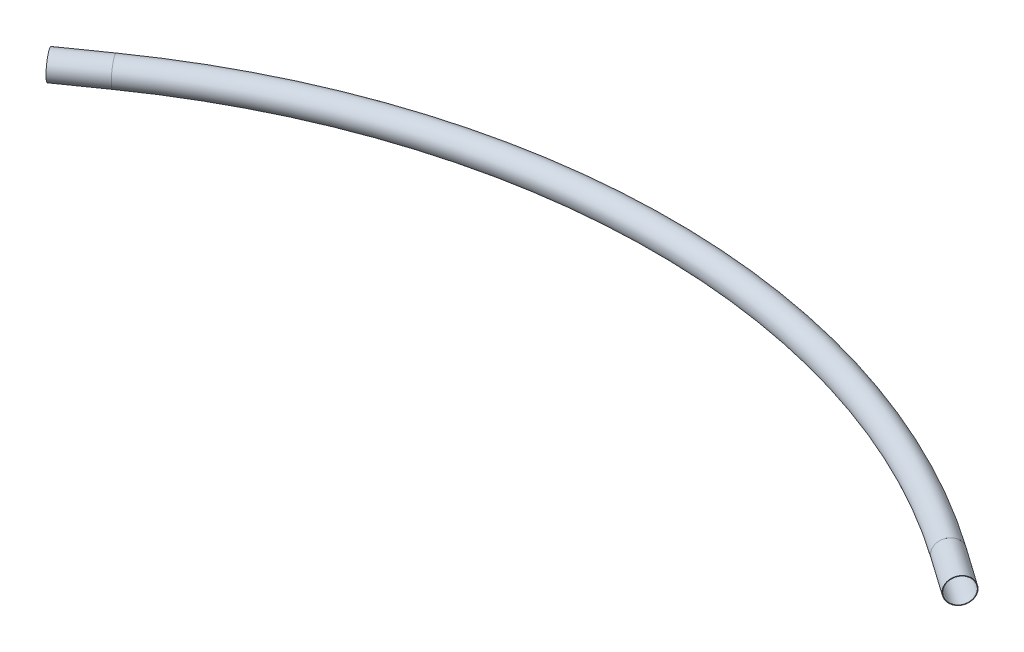
ISO-10303-21;
HEADER;
FILE_DESCRIPTION(('STEP AP214'),'2;1');
FILE_NAME('part.step','',(''),(''),'','','');
FILE_SCHEMA(('AUTOMOTIVE_DESIGN { 1 0 10303 214 1 1 1 1 }'));
ENDSEC;
DATA;
#1=APPLICATION_CONTEXT('core data for automotive mechanical design processes');
#2=APPLICATION_PROTOCOL_DEFINITION('international standard','automotive_design',2000,#1);
#3=PRODUCT_CONTEXT('',#1,'mechanical');
#4=PRODUCT('Part','Part','',(#3));
#5=PRODUCT_RELATED_PRODUCT_CATEGORY('part','',(#4));
#6=PRODUCT_DEFINITION_FORMATION('','',#4);
#7=PRODUCT_DEFINITION_CONTEXT('part definition',#1,'design');
#8=PRODUCT_DEFINITION('design','',#6,#7);
#9=PRODUCT_DEFINITION_SHAPE('','',#8);
#10=(LENGTH_UNIT() NAMED_UNIT(*) SI_UNIT(.MILLI.,.METRE.));
#11=(NAMED_UNIT(*) PLANE_ANGLE_UNIT() SI_UNIT($,.RADIAN.));
#12=(NAMED_UNIT(*) SI_UNIT($,.STERADIAN.) SOLID_ANGLE_UNIT());
#13=UNCERTAINTY_MEASURE_WITH_UNIT(LENGTH_MEASURE(1.E-05),#10,'distance_accuracy_value','');
#14=(GEOMETRIC_REPRESENTATION_CONTEXT(3) GLOBAL_UNCERTAINTY_ASSIGNED_CONTEXT((#13)) GLOBAL_UNIT_ASSIGNED_CONTEXT((#10,
#11,#12)) REPRESENTATION_CONTEXT('',''));
#15=CARTESIAN_POINT('',(0.,0.,0.));
#16=DIRECTION('',(0.,0.,1.));
#17=DIRECTION('',(1.,0.,0.));
#18=AXIS2_PLACEMENT_3D('',#15,#16,#17);
#19=CARTESIAN_POINT('',(-2960.85364789533,0.,175.216609990326));
#20=DIRECTION('',(0.818253437976806,0.,-0.574857644325217));
#21=DIRECTION('',(-0.574857644325217,0.,-0.818253437976806));
#22=AXIS2_PLACEMENT_3D('',#19,#20,#21);
#23=CYLINDRICAL_SURFACE('',#22,80.7339000000001);
#24=CARTESIAN_POINT('',(-2960.85364789533,0.,175.216609990326));
#25=DIRECTION('',(-0.818253437976804,0.,0.574857644325219));
#26=DIRECTION('',(0.574857644325219,0.,0.818253437976804));
#27=AXIS2_PLACEMENT_3D('',#24,#25,#26);
#28=CIRCLE('',#27,80.7339000000001);
#29=CARTESIAN_POINT('',(-2914.44314832414,0.,241.277401226601));
#30=VERTEX_POINT('',#29);
#31=EDGE_CURVE('E52',#30,#30,#28,.T.);
#32=ORIENTED_EDGE('',*,*,#31,.T.);
#33=EDGE_LOOP('',(#32));
#34=FACE_BOUND('',#33,.T.);
#35=CARTESIAN_POINT('',(-2711.45,0.,-4.44089209850063E-13));
#36=DIRECTION('',(-0.818253437976804,0.,0.574857644325219));
#37=DIRECTION('',(0.574857644325219,0.,0.818253437976804));
#38=AXIS2_PLACEMENT_3D('',#35,#36,#37);
#39=CIRCLE('',#38,80.7339000000001);
#40=CARTESIAN_POINT('',(-2665.03950042881,0.,66.0607912362752));
#41=VERTEX_POINT('',#40);
#42=EDGE_CURVE('E58',#41,#41,#39,.T.);
#43=ORIENTED_EDGE('',*,*,#42,.F.);
#44=EDGE_LOOP('',(#43));
#45=FACE_BOUND('',#44,.T.);
#46=ADVANCED_FACE('F45',(#34,#45),#23,.F.);
#47=CARTESIAN_POINT('',(-2960.85364789533,0.,175.216609990326));
#48=DIRECTION('',(0.818253437976806,0.,-0.574857644325217));
#49=DIRECTION('',(-0.574857644325217,0.,-0.818253437976806));
#50=AXIS2_PLACEMENT_3D('',#47,#48,#49);
#51=CYLINDRICAL_SURFACE('',#50,84.1374999999999);
#52=CARTESIAN_POINT('',(-2960.85364789533,0.,175.216609990326));
#53=DIRECTION('',(-0.818253437976804,0.,0.574857644325219));
#54=DIRECTION('',(0.574857644325219,0.,0.818253437976804));
#55=AXIS2_PLACEMENT_3D('',#52,#53,#54);
#56=CIRCLE('',#55,84.1374999999999);
#57=CARTESIAN_POINT('',(-2912.48656284592,0.,244.062408628099));
#58=VERTEX_POINT('',#57);
#59=EDGE_CURVE('E12',#58,#58,#56,.T.);
#60=ORIENTED_EDGE('',*,*,#59,.F.);
#61=EDGE_LOOP('',(#60));
#62=FACE_BOUND('',#61,.T.);
#63=CARTESIAN_POINT('',(-2711.45,0.,-4.44089209850063E-13));
#64=DIRECTION('',(-0.818253437976804,0.,0.574857644325219));
#65=DIRECTION('',(0.574857644325219,0.,0.818253437976804));
#66=AXIS2_PLACEMENT_3D('',#63,#64,#65);
#67=CIRCLE('',#66,84.1374999999999);
#68=CARTESIAN_POINT('',(-2663.08291495059,0.,68.8457986377729));
#69=VERTEX_POINT('',#68);
#70=EDGE_CURVE('E48',#69,#69,#67,.T.);
#71=ORIENTED_EDGE('',*,*,#70,.T.);
#72=EDGE_LOOP('',(#71));
#73=FACE_BOUND('',#72,.T.);
#74=ADVANCED_FACE('F65',(#62,#73),#51,.T.);
#75=CARTESIAN_POINT('',(-2960.85364789533,0.,175.216609990326));
#76=DIRECTION('',(-0.818253437976804,0.,0.574857644325219));
#77=DIRECTION('',(0.574857644325219,0.,0.818253437976804));
#78=AXIS2_PLACEMENT_3D('',#75,#76,#77);
#79=PLANE('',#78);
#80=ORIENTED_EDGE('',*,*,#31,.F.);
#81=EDGE_LOOP('',(#80));
#82=FACE_BOUND('',#81,.T.);
#83=ORIENTED_EDGE('',*,*,#59,.T.);
#84=EDGE_LOOP('',(#83));
#85=FACE_BOUND('',#84,.T.);
#86=ADVANCED_FACE('F69',(#82,#85),#79,.T.);
#87=CARTESIAN_POINT('',(-2711.45,0.,-4.44089209850063E-13));
#88=DIRECTION('',(-0.818253437976804,0.,0.574857644325219));
#89=DIRECTION('',(0.574857644325219,0.,0.818253437976804));
#90=AXIS2_PLACEMENT_3D('',#87,#88,#89);
#91=PLANE('',#90);
#92=ORIENTED_EDGE('',*,*,#42,.T.);
#93=EDGE_LOOP('',(#92));
#94=FACE_BOUND('',#93,.T.);
#95=ORIENTED_EDGE('',*,*,#70,.F.);
#96=EDGE_LOOP('',(#95));
#97=FACE_BOUND('',#96,.T.);
#98=ADVANCED_FACE('F67',(#94,#97),#91,.F.);
#99=CLOSED_SHELL('',(#46,#74,#86,#98));
#100=MANIFOLD_SOLID_BREP('B2',#99);
#101=CARTESIAN_POINT('',(0.,0.,3859.48296296296));
#102=DIRECTION('',(0.,-1.,0.));
#103=DIRECTION('',(0.,0.,-1.));
#104=AXIS2_PLACEMENT_3D('',#101,#102,#103);
#105=TOROIDAL_SURFACE('',#104,4716.73296296296,80.7339000000001);
#106=CARTESIAN_POINT('',(-2711.45,0.,-8.88178419700125E-13));
#107=DIRECTION('',(-0.818253437976804,0.,0.574857644325219));
#108=DIRECTION('',(0.574857644325219,0.,0.818253437976804));
#109=AXIS2_PLACEMENT_3D('',#106,#107,#108);
#110=CIRCLE('',#109,80.7339000000001);
#111=CARTESIAN_POINT('',(-2757.86049957119,0.,-66.0607912362772));
#112=VERTEX_POINT('',#111);
#113=EDGE_CURVE('E129',#112,#112,#110,.T.);
#114=CARTESIAN_POINT('',(2711.45,0.,0.));
#115=DIRECTION('',(-0.818253437976804,0.,-0.574857644325219));
#116=DIRECTION('',(-0.574857644325219,0.,0.818253437976804));
#117=AXIS2_PLACEMENT_3D('',#114,#115,#116);
#118=CIRCLE('',#117,80.7339000000001);
#119=CARTESIAN_POINT('',(2757.86049957119,0.,-66.0607912362763));
#120=VERTEX_POINT('',#119);
#121=EDGE_CURVE('E137',#120,#120,#118,.T.);
#122=CARTESIAN_POINT('',(0.,0.,3859.48296296296));
#123=DIRECTION('',(0.,-1.,0.));
#124=DIRECTION('',(0.,0.,-1.));
#125=AXIS2_PLACEMENT_3D('',#122,#123,#124);
#126=CIRCLE('',#125,4797.46686296297);
#127=EDGE_CURVE('',#112,#120,#126,.T.);
#128=ORIENTED_EDGE('',*,*,#113,.T.);
#129=ORIENTED_EDGE('',*,*,#121,.F.);
#130=ORIENTED_EDGE('',*,*,#127,.T.);
#131=ORIENTED_EDGE('',*,*,#127,.F.);
#132=EDGE_LOOP('',(#128,#130,#129,#131));
#133=FACE_BOUND('',#132,.T.);
#134=ADVANCED_FACE('F122',(#133),#105,.F.);
#135=CARTESIAN_POINT('',(0.,0.,3859.48296296296));
#136=DIRECTION('',(0.,-1.,0.));
#137=DIRECTION('',(0.,0.,-1.));
#138=AXIS2_PLACEMENT_3D('',#135,#136,#137);
#139=TOROIDAL_SURFACE('',#138,4716.73296296296,84.1374999999999);
#140=CARTESIAN_POINT('',(-2711.45,0.,-8.88178419700125E-13));
#141=DIRECTION('',(-0.818253437976804,0.,0.574857644325219));
#142=DIRECTION('',(0.574857644325219,0.,0.818253437976804));
#143=AXIS2_PLACEMENT_3D('',#140,#141,#142);
#144=CIRCLE('',#143,84.1374999999999);
#145=CARTESIAN_POINT('',(-2759.81708504941,0.,-68.8457986377746));
#146=VERTEX_POINT('',#145);
#147=EDGE_CURVE('E44',#146,#146,#144,.T.);
#148=CARTESIAN_POINT('',(2711.45,0.,0.));
#149=DIRECTION('',(-0.818253437976804,0.,-0.574857644325219));
#150=DIRECTION('',(-0.574857644325219,0.,0.818253437976804));
#151=AXIS2_PLACEMENT_3D('',#148,#149,#150);
#152=CIRCLE('',#151,84.1374999999999);
#153=CARTESIAN_POINT('',(2759.81708504941,0.,-68.8457986377737));
#154=VERTEX_POINT('',#153);
#155=EDGE_CURVE('E133',#154,#154,#152,.T.);
#156=CARTESIAN_POINT('',(0.,0.,3859.48296296296));
#157=DIRECTION('',(0.,-1.,0.));
#158=DIRECTION('',(0.,0.,-1.));
#159=AXIS2_PLACEMENT_3D('',#156,#157,#158);
#160=CIRCLE('',#159,4800.87046296296);
#161=EDGE_CURVE('',#146,#154,#160,.T.);
#162=ORIENTED_EDGE('',*,*,#147,.F.);
#163=ORIENTED_EDGE('',*,*,#155,.T.);
#164=ORIENTED_EDGE('',*,*,#161,.T.);
#165=ORIENTED_EDGE('',*,*,#161,.F.);
#166=EDGE_LOOP('',(#162,#164,#163,#165));
#167=FACE_BOUND('',#166,.T.);
#168=ADVANCED_FACE('F124',(#167),#139,.T.);
#169=CARTESIAN_POINT('',(-2711.45,0.,-8.88178419700125E-13));
#170=DIRECTION('',(-0.818253437976804,0.,0.574857644325219));
#171=DIRECTION('',(0.574857644325219,0.,0.818253437976804));
#172=AXIS2_PLACEMENT_3D('',#169,#170,#171);
#173=PLANE('',#172);
#174=ORIENTED_EDGE('',*,*,#113,.F.);
#175=EDGE_LOOP('',(#174));
#176=FACE_BOUND('',#175,.T.);
#177=ORIENTED_EDGE('',*,*,#147,.T.);
#178=EDGE_LOOP('',(#177));
#179=FACE_BOUND('',#178,.T.);
#180=ADVANCED_FACE('F147',(#176,#179),#173,.T.);
#181=CARTESIAN_POINT('',(2711.45,0.,0.));
#182=DIRECTION('',(-0.818253437976804,0.,-0.574857644325219));
#183=DIRECTION('',(-0.574857644325219,0.,0.818253437976804));
#184=AXIS2_PLACEMENT_3D('',#181,#182,#183);
#185=PLANE('',#184);
#186=ORIENTED_EDGE('',*,*,#121,.T.);
#187=EDGE_LOOP('',(#186));
#188=FACE_BOUND('',#187,.T.);
#189=ORIENTED_EDGE('',*,*,#155,.F.);
#190=EDGE_LOOP('',(#189));
#191=FACE_BOUND('',#190,.T.);
#192=ADVANCED_FACE('F143',(#188,#191),#185,.F.);
#193=CLOSED_SHELL('',(#134,#168,#180,#192));
#194=MANIFOLD_SOLID_BREP('B7',#193);
#195=CARTESIAN_POINT('',(2711.45,0.,0.));
#196=DIRECTION('',(0.818253437976806,0.,0.574857644325217));
#197=DIRECTION('',(0.574857644325217,0.,-0.818253437976806));
#198=AXIS2_PLACEMENT_3D('',#195,#196,#197);
#199=CYLINDRICAL_SURFACE('',#198,80.7339000000001);
#200=CARTESIAN_POINT('',(2711.45,0.,0.));
#201=DIRECTION('',(-0.818253437976804,0.,-0.574857644325219));
#202=DIRECTION('',(-0.574857644325219,0.,0.818253437976804));
#203=AXIS2_PLACEMENT_3D('',#200,#201,#202);
#204=CIRCLE('',#203,80.7339000000001);
#205=CARTESIAN_POINT('',(2665.03950042881,0.,66.0607912362756));
#206=VERTEX_POINT('',#205);
#207=EDGE_CURVE('E199',#206,#206,#204,.T.);
#208=ORIENTED_EDGE('',*,*,#207,.T.);
#209=EDGE_LOOP('',(#208));
#210=FACE_BOUND('',#209,.T.);
#211=CARTESIAN_POINT('',(2960.85364789533,0.,175.216609990326));
#212=DIRECTION('',(-0.818253437976804,0.,-0.574857644325219));
#213=DIRECTION('',(-0.574857644325219,0.,0.818253437976804));
#214=AXIS2_PLACEMENT_3D('',#211,#212,#213);
#215=CIRCLE('',#214,80.7339000000001);
#216=CARTESIAN_POINT('',(2914.44314832414,0.,241.277401226602));
#217=VERTEX_POINT('',#216);
#218=EDGE_CURVE('E205',#217,#217,#215,.T.);
#219=ORIENTED_EDGE('',*,*,#218,.F.);
#220=EDGE_LOOP('',(#219));
#221=FACE_BOUND('',#220,.T.);
#222=ADVANCED_FACE('F192',(#210,#221),#199,.F.);
#223=CARTESIAN_POINT('',(2711.45,0.,0.));
#224=DIRECTION('',(0.818253437976806,0.,0.574857644325217));
#225=DIRECTION('',(0.574857644325217,0.,-0.818253437976806));
#226=AXIS2_PLACEMENT_3D('',#223,#224,#225);
#227=CYLINDRICAL_SURFACE('',#226,84.1374999999999);
#228=CARTESIAN_POINT('',(2711.45,0.,0.));
#229=DIRECTION('',(-0.818253437976804,0.,-0.574857644325219));
#230=DIRECTION('',(-0.574857644325219,0.,0.818253437976804));
#231=AXIS2_PLACEMENT_3D('',#228,#229,#230);
#232=CIRCLE('',#231,84.1374999999999);
#233=CARTESIAN_POINT('',(2663.08291495059,0.,68.8457986377733));
#234=VERTEX_POINT('',#233);
#235=EDGE_CURVE('E121',#234,#234,#232,.T.);
#236=ORIENTED_EDGE('',*,*,#235,.F.);
#237=EDGE_LOOP('',(#236));
#238=FACE_BOUND('',#237,.T.);
#239=CARTESIAN_POINT('',(2960.85364789533,0.,175.216609990326));
#240=DIRECTION('',(-0.818253437976804,0.,-0.574857644325219));
#241=DIRECTION('',(-0.574857644325219,0.,0.818253437976804));
#242=AXIS2_PLACEMENT_3D('',#239,#240,#241);
#243=CIRCLE('',#242,84.1374999999999);
#244=CARTESIAN_POINT('',(2912.48656284592,0.,244.0624086281));
#245=VERTEX_POINT('',#244);
#246=EDGE_CURVE('E195',#245,#245,#243,.T.);
#247=ORIENTED_EDGE('',*,*,#246,.T.);
#248=EDGE_LOOP('',(#247));
#249=FACE_BOUND('',#248,.T.);
#250=ADVANCED_FACE('F212',(#238,#249),#227,.T.);
#251=CARTESIAN_POINT('',(2711.45,0.,0.));
#252=DIRECTION('',(-0.818253437976804,0.,-0.574857644325219));
#253=DIRECTION('',(-0.574857644325219,0.,0.818253437976804));
#254=AXIS2_PLACEMENT_3D('',#251,#252,#253);
#255=PLANE('',#254);
#256=ORIENTED_EDGE('',*,*,#207,.F.);
#257=EDGE_LOOP('',(#256));
#258=FACE_BOUND('',#257,.T.);
#259=ORIENTED_EDGE('',*,*,#235,.T.);
#260=EDGE_LOOP('',(#259));
#261=FACE_BOUND('',#260,.T.);
#262=ADVANCED_FACE('F216',(#258,#261),#255,.T.);
#263=CARTESIAN_POINT('',(2960.85364789533,0.,175.216609990326));
#264=DIRECTION('',(-0.818253437976804,0.,-0.574857644325219));
#265=DIRECTION('',(-0.574857644325219,0.,0.818253437976804));
#266=AXIS2_PLACEMENT_3D('',#263,#264,#265);
#267=PLANE('',#266);
#268=ORIENTED_EDGE('',*,*,#218,.T.);
#269=EDGE_LOOP('',(#268));
#270=FACE_BOUND('',#269,.T.);
#271=ORIENTED_EDGE('',*,*,#246,.F.);
#272=EDGE_LOOP('',(#271));
#273=FACE_BOUND('',#272,.T.);
#274=ADVANCED_FACE('F214',(#270,#273),#267,.F.);
#275=CLOSED_SHELL('',(#222,#250,#262,#274));
#276=MANIFOLD_SOLID_BREP('B39',#275);
#277=ADVANCED_BREP_SHAPE_REPRESENTATION('',(#18,#100,#194,#276),#14);
#278=SHAPE_DEFINITION_REPRESENTATION(#9,#277);
ENDSEC;
END-ISO-10303-21;
